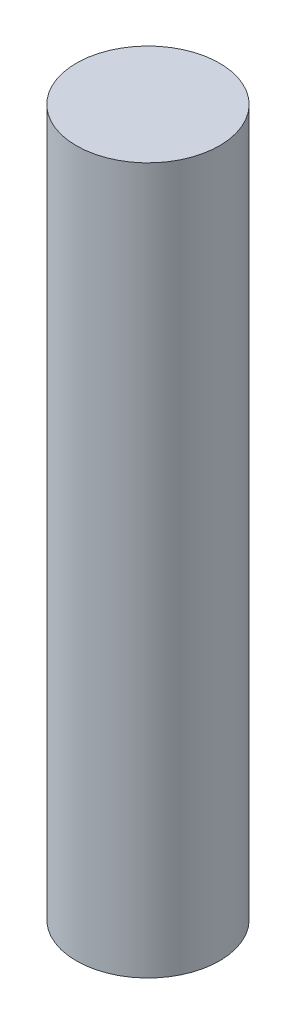
ISO-10303-21;
HEADER;
FILE_DESCRIPTION(('STEP AP214'),'2;1');
FILE_NAME('part.step','',(''),(''),'','','');
FILE_SCHEMA(('AUTOMOTIVE_DESIGN { 1 0 10303 214 1 1 1 1 }'));
ENDSEC;
DATA;
#1=APPLICATION_CONTEXT('core data for automotive mechanical design processes');
#2=APPLICATION_PROTOCOL_DEFINITION('international standard','automotive_design',2000,#1);
#3=PRODUCT_CONTEXT('',#1,'mechanical');
#4=PRODUCT('Part','Part','',(#3));
#5=PRODUCT_RELATED_PRODUCT_CATEGORY('part','',(#4));
#6=PRODUCT_DEFINITION_FORMATION('','',#4);
#7=PRODUCT_DEFINITION_CONTEXT('part definition',#1,'design');
#8=PRODUCT_DEFINITION('design','',#6,#7);
#9=PRODUCT_DEFINITION_SHAPE('','',#8);
#10=(LENGTH_UNIT() NAMED_UNIT(*) SI_UNIT(.MILLI.,.METRE.));
#11=(NAMED_UNIT(*) PLANE_ANGLE_UNIT() SI_UNIT($,.RADIAN.));
#12=(NAMED_UNIT(*) SI_UNIT($,.STERADIAN.) SOLID_ANGLE_UNIT());
#13=UNCERTAINTY_MEASURE_WITH_UNIT(LENGTH_MEASURE(1.E-05),#10,'distance_accuracy_value','');
#14=(GEOMETRIC_REPRESENTATION_CONTEXT(3) GLOBAL_UNCERTAINTY_ASSIGNED_CONTEXT((#13)) GLOBAL_UNIT_ASSIGNED_CONTEXT((#10,
#11,#12)) REPRESENTATION_CONTEXT('',''));
#15=CARTESIAN_POINT('',(0.,0.,0.));
#16=DIRECTION('',(0.,0.,1.));
#17=DIRECTION('',(1.,0.,0.));
#18=AXIS2_PLACEMENT_3D('',#15,#16,#17);
#19=CARTESIAN_POINT('',(0.,36.,0.));
#20=DIRECTION('',(0.,-1.,0.));
#21=DIRECTION('',(0.,0.,-1.));
#22=AXIS2_PLACEMENT_3D('',#19,#20,#21);
#23=CYLINDRICAL_SURFACE('',#22,3.65);
#24=CARTESIAN_POINT('',(0.,36.,0.));
#25=DIRECTION('',(0.,1.,0.));
#26=DIRECTION('',(0.,0.,1.));
#27=AXIS2_PLACEMENT_3D('',#24,#25,#26);
#28=CIRCLE('',#27,3.65);
#29=CARTESIAN_POINT('',(0.,36.,3.65));
#30=VERTEX_POINT('',#29);
#31=EDGE_CURVE('E10',#30,#30,#28,.T.);
#32=ORIENTED_EDGE('',*,*,#31,.F.);
#33=EDGE_LOOP('',(#32));
#34=FACE_BOUND('',#33,.T.);
#35=CARTESIAN_POINT('',(0.,0.,0.));
#36=DIRECTION('',(0.,1.,0.));
#37=DIRECTION('',(0.,0.,1.));
#38=AXIS2_PLACEMENT_3D('',#35,#36,#37);
#39=CIRCLE('',#38,3.65);
#40=CARTESIAN_POINT('',(0.,0.,3.65));
#41=VERTEX_POINT('',#40);
#42=EDGE_CURVE('E42',#41,#41,#39,.T.);
#43=ORIENTED_EDGE('',*,*,#42,.T.);
#44=EDGE_LOOP('',(#43));
#45=FACE_BOUND('',#44,.T.);
#46=ADVANCED_FACE('F39',(#34,#45),#23,.T.);
#47=CARTESIAN_POINT('',(0.,36.,0.));
#48=DIRECTION('',(0.,1.,0.));
#49=DIRECTION('',(0.,0.,1.));
#50=AXIS2_PLACEMENT_3D('',#47,#48,#49);
#51=PLANE('',#50);
#52=ORIENTED_EDGE('',*,*,#31,.T.);
#53=EDGE_LOOP('',(#52));
#54=FACE_BOUND('',#53,.T.);
#55=ADVANCED_FACE('F54',(#54),#51,.T.);
#56=CARTESIAN_POINT('',(0.,0.,0.));
#57=DIRECTION('',(0.,1.,0.));
#58=DIRECTION('',(0.,0.,1.));
#59=AXIS2_PLACEMENT_3D('',#56,#57,#58);
#60=PLANE('',#59);
#61=ORIENTED_EDGE('',*,*,#42,.F.);
#62=EDGE_LOOP('',(#61));
#63=FACE_BOUND('',#62,.T.);
#64=ADVANCED_FACE('F52',(#63),#60,.F.);
#65=CLOSED_SHELL('',(#46,#55,#64));
#66=MANIFOLD_SOLID_BREP('B2',#65);
#67=ADVANCED_BREP_SHAPE_REPRESENTATION('',(#18,#66),#14);
#68=SHAPE_DEFINITION_REPRESENTATION(#9,#67);
ENDSEC;
END-ISO-10303-21;
